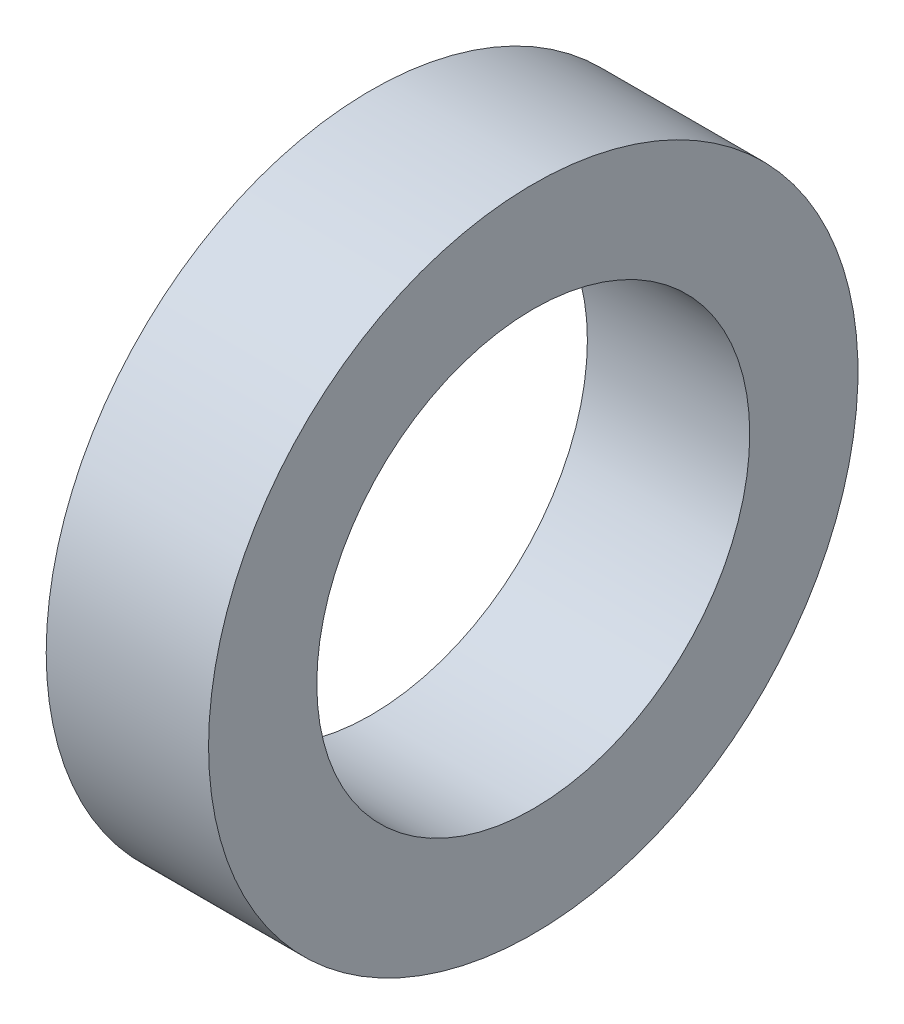
ISO-10303-21;
HEADER;
FILE_DESCRIPTION(('STEP AP214'),'2;1');
FILE_NAME('part.step','',(''),(''),'','','');
FILE_SCHEMA(('AUTOMOTIVE_DESIGN { 1 0 10303 214 1 1 1 1 }'));
ENDSEC;
DATA;
#1=APPLICATION_CONTEXT('core data for automotive mechanical design processes');
#2=APPLICATION_PROTOCOL_DEFINITION('international standard','automotive_design',2000,#1);
#3=PRODUCT_CONTEXT('',#1,'mechanical');
#4=PRODUCT('Part','Part','',(#3));
#5=PRODUCT_RELATED_PRODUCT_CATEGORY('part','',(#4));
#6=PRODUCT_DEFINITION_FORMATION('','',#4);
#7=PRODUCT_DEFINITION_CONTEXT('part definition',#1,'design');
#8=PRODUCT_DEFINITION('design','',#6,#7);
#9=PRODUCT_DEFINITION_SHAPE('','',#8);
#10=(LENGTH_UNIT() NAMED_UNIT(*) SI_UNIT(.MILLI.,.METRE.));
#11=(NAMED_UNIT(*) PLANE_ANGLE_UNIT() SI_UNIT($,.RADIAN.));
#12=(NAMED_UNIT(*) SI_UNIT($,.STERADIAN.) SOLID_ANGLE_UNIT());
#13=UNCERTAINTY_MEASURE_WITH_UNIT(LENGTH_MEASURE(1.E-05),#10,'distance_accuracy_value','');
#14=(GEOMETRIC_REPRESENTATION_CONTEXT(3) GLOBAL_UNCERTAINTY_ASSIGNED_CONTEXT((#13)) GLOBAL_UNIT_ASSIGNED_CONTEXT((#10,
#11,#12)) REPRESENTATION_CONTEXT('',''));
#15=CARTESIAN_POINT('',(0.,0.,0.));
#16=DIRECTION('',(0.,0.,1.));
#17=DIRECTION('',(1.,0.,0.));
#18=AXIS2_PLACEMENT_3D('',#15,#16,#17);
#19=CARTESIAN_POINT('',(0.,0.,0.));
#20=DIRECTION('',(-1.,0.,0.));
#21=DIRECTION('',(0.,0.,1.));
#22=AXIS2_PLACEMENT_3D('',#19,#20,#21);
#23=PLANE('',#22);
#24=CARTESIAN_POINT('',(0.,-4.,0.));
#25=DIRECTION('',(-1.,0.,0.));
#26=DIRECTION('',(0.,0.,1.));
#27=AXIS2_PLACEMENT_3D('',#24,#25,#26);
#28=CIRCLE('',#27,6.00000000000001);
#29=CARTESIAN_POINT('',(0.,-4.,6.00000000000001));
#30=VERTEX_POINT('',#29);
#31=EDGE_CURVE('E10',#30,#30,#28,.T.);
#32=ORIENTED_EDGE('',*,*,#31,.F.);
#33=EDGE_LOOP('',(#32));
#34=FACE_BOUND('',#33,.T.);
#35=CARTESIAN_POINT('',(0.,-4.,0.));
#36=DIRECTION('',(-1.,0.,0.));
#37=DIRECTION('',(0.,0.,1.));
#38=AXIS2_PLACEMENT_3D('',#35,#36,#37);
#39=CIRCLE('',#38,4.);
#40=CARTESIAN_POINT('',(0.,-4.,4.));
#41=VERTEX_POINT('',#40);
#42=EDGE_CURVE('E43',#41,#41,#39,.T.);
#43=ORIENTED_EDGE('',*,*,#42,.T.);
#44=EDGE_LOOP('',(#43));
#45=FACE_BOUND('',#44,.T.);
#46=ADVANCED_FACE('F29',(#34,#45),#23,.F.);
#47=CARTESIAN_POINT('',(0.,-4.,0.));
#48=DIRECTION('',(-1.,0.,0.));
#49=DIRECTION('',(0.,0.,1.));
#50=AXIS2_PLACEMENT_3D('',#47,#48,#49);
#51=CYLINDRICAL_SURFACE('',#50,6.);
#52=ORIENTED_EDGE('',*,*,#31,.T.);
#53=EDGE_LOOP('',(#52));
#54=FACE_BOUND('',#53,.T.);
#55=CARTESIAN_POINT('',(-3.,-4.,0.));
#56=DIRECTION('',(-1.,0.,0.));
#57=DIRECTION('',(0.,0.,1.));
#58=AXIS2_PLACEMENT_3D('',#55,#56,#57);
#59=CIRCLE('',#58,6.);
#60=CARTESIAN_POINT('',(-3.,-4.,6.));
#61=VERTEX_POINT('',#60);
#62=EDGE_CURVE('E35',#61,#61,#59,.T.);
#63=ORIENTED_EDGE('',*,*,#62,.F.);
#64=EDGE_LOOP('',(#63));
#65=FACE_BOUND('',#64,.T.);
#66=ADVANCED_FACE('F58',(#54,#65),#51,.T.);
#67=CARTESIAN_POINT('',(-3.,2.,0.));
#68=DIRECTION('',(1.,0.,0.));
#69=DIRECTION('',(0.,0.,-1.));
#70=AXIS2_PLACEMENT_3D('',#67,#68,#69);
#71=PLANE('',#70);
#72=CARTESIAN_POINT('',(-3.,-4.,0.));
#73=DIRECTION('',(-1.,0.,0.));
#74=DIRECTION('',(0.,0.,1.));
#75=AXIS2_PLACEMENT_3D('',#72,#73,#74);
#76=CIRCLE('',#75,4.);
#77=CARTESIAN_POINT('',(-3.,-4.,4.));
#78=VERTEX_POINT('',#77);
#79=EDGE_CURVE('E39',#78,#78,#76,.T.);
#80=ORIENTED_EDGE('',*,*,#79,.F.);
#81=EDGE_LOOP('',(#80));
#82=FACE_BOUND('',#81,.T.);
#83=ORIENTED_EDGE('',*,*,#62,.T.);
#84=EDGE_LOOP('',(#83));
#85=FACE_BOUND('',#84,.T.);
#86=ADVANCED_FACE('F52',(#82,#85),#71,.F.);
#87=CARTESIAN_POINT('',(0.,-4.,0.));
#88=DIRECTION('',(-1.,0.,0.));
#89=DIRECTION('',(0.,0.,1.));
#90=AXIS2_PLACEMENT_3D('',#87,#88,#89);
#91=CYLINDRICAL_SURFACE('',#90,4.);
#92=ORIENTED_EDGE('',*,*,#79,.T.);
#93=EDGE_LOOP('',(#92));
#94=FACE_BOUND('',#93,.T.);
#95=ORIENTED_EDGE('',*,*,#42,.F.);
#96=EDGE_LOOP('',(#95));
#97=FACE_BOUND('',#96,.T.);
#98=ADVANCED_FACE('F50',(#94,#97),#91,.F.);
#99=CLOSED_SHELL('',(#46,#66,#86,#98));
#100=MANIFOLD_SOLID_BREP('B2',#99);
#101=ADVANCED_BREP_SHAPE_REPRESENTATION('',(#18,#100),#14);
#102=SHAPE_DEFINITION_REPRESENTATION(#9,#101);
ENDSEC;
END-ISO-10303-21;
